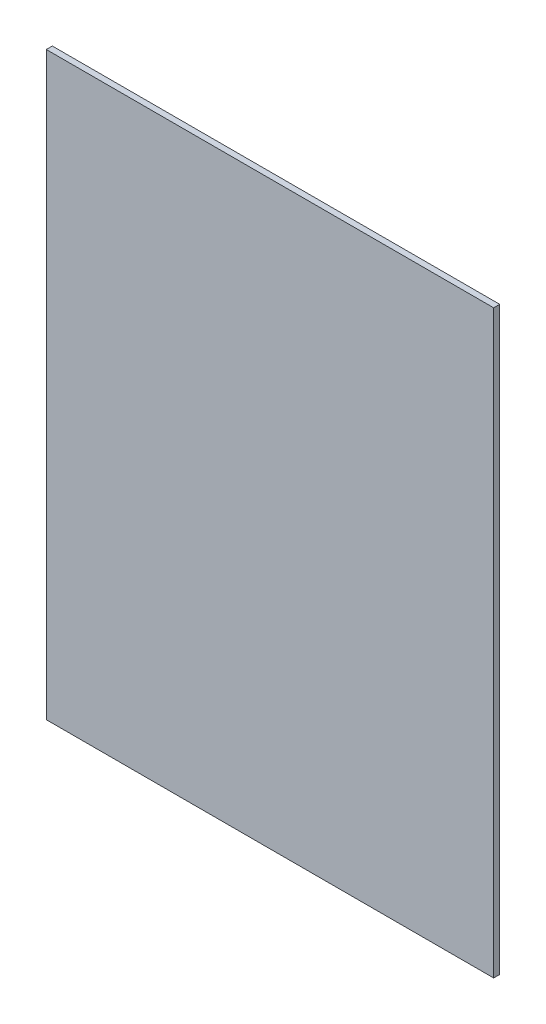
ISO-10303-21;
HEADER;
FILE_DESCRIPTION(('STEP AP214'),'2;1');
FILE_NAME('part.step','',(''),(''),'','','');
FILE_SCHEMA(('AUTOMOTIVE_DESIGN { 1 0 10303 214 1 1 1 1 }'));
ENDSEC;
DATA;
#1=APPLICATION_CONTEXT('core data for automotive mechanical design processes');
#2=APPLICATION_PROTOCOL_DEFINITION('international standard','automotive_design',2000,#1);
#3=PRODUCT_CONTEXT('',#1,'mechanical');
#4=PRODUCT('Part','Part','',(#3));
#5=PRODUCT_RELATED_PRODUCT_CATEGORY('part','',(#4));
#6=PRODUCT_DEFINITION_FORMATION('','',#4);
#7=PRODUCT_DEFINITION_CONTEXT('part definition',#1,'design');
#8=PRODUCT_DEFINITION('design','',#6,#7);
#9=PRODUCT_DEFINITION_SHAPE('','',#8);
#10=(LENGTH_UNIT() NAMED_UNIT(*) SI_UNIT(.MILLI.,.METRE.));
#11=(NAMED_UNIT(*) PLANE_ANGLE_UNIT() SI_UNIT($,.RADIAN.));
#12=(NAMED_UNIT(*) SI_UNIT($,.STERADIAN.) SOLID_ANGLE_UNIT());
#13=UNCERTAINTY_MEASURE_WITH_UNIT(LENGTH_MEASURE(1.E-05),#10,'distance_accuracy_value','');
#14=(GEOMETRIC_REPRESENTATION_CONTEXT(3) GLOBAL_UNCERTAINTY_ASSIGNED_CONTEXT((#13)) GLOBAL_UNIT_ASSIGNED_CONTEXT((#10,
#11,#12)) REPRESENTATION_CONTEXT('',''));
#15=CARTESIAN_POINT('',(0.,0.,0.));
#16=DIRECTION('',(0.,0.,1.));
#17=DIRECTION('',(1.,0.,0.));
#18=AXIS2_PLACEMENT_3D('',#15,#16,#17);
#19=CARTESIAN_POINT('',(117.475,-152.4,3.175));
#20=DIRECTION('',(-1.,0.,0.));
#21=DIRECTION('',(0.,0.,1.));
#22=AXIS2_PLACEMENT_3D('',#19,#20,#21);
#23=PLANE('',#22);
#24=DIRECTION('',(0.,1.,0.));
#25=VECTOR('',#24,1.);
#26=CARTESIAN_POINT('',(117.475,-152.4,0.));
#27=LINE('',#26,#25);
#28=CARTESIAN_POINT('',(117.475,-152.4,0.));
#29=VERTEX_POINT('',#28);
#30=CARTESIAN_POINT('',(117.475,152.4,0.));
#31=VERTEX_POINT('',#30);
#32=EDGE_CURVE('E94',#29,#31,#27,.T.);
#33=ORIENTED_EDGE('',*,*,#32,.T.);
#34=DIRECTION('',(0.,0.,-1.));
#35=VECTOR('',#34,1.);
#36=CARTESIAN_POINT('',(117.475,152.4,3.175));
#37=LINE('',#36,#35);
#38=CARTESIAN_POINT('',(117.475,152.4,3.175));
#39=VERTEX_POINT('',#38);
#40=EDGE_CURVE('E11',#39,#31,#37,.T.);
#41=ORIENTED_EDGE('',*,*,#40,.F.);
#42=DIRECTION('',(0.,1.,0.));
#43=VECTOR('',#42,1.);
#44=CARTESIAN_POINT('',(117.475,-152.4,3.175));
#45=LINE('',#44,#43);
#46=CARTESIAN_POINT('',(117.475,-152.4,3.175));
#47=VERTEX_POINT('',#46);
#48=EDGE_CURVE('E82',#47,#39,#45,.T.);
#49=ORIENTED_EDGE('',*,*,#48,.F.);
#50=DIRECTION('',(0.,0.,-1.));
#51=VECTOR('',#50,1.);
#52=CARTESIAN_POINT('',(117.475,-152.4,3.175));
#53=LINE('',#52,#51);
#54=EDGE_CURVE('E90',#47,#29,#53,.T.);
#55=ORIENTED_EDGE('',*,*,#54,.T.);
#56=EDGE_LOOP('',(#33,#41,#49,#55));
#57=FACE_BOUND('',#56,.T.);
#58=ADVANCED_FACE('F31',(#57),#23,.F.);
#59=CARTESIAN_POINT('',(-117.475,152.4,3.175));
#60=DIRECTION('',(0.,-1.,0.));
#61=DIRECTION('',(0.,0.,-1.));
#62=AXIS2_PLACEMENT_3D('',#59,#60,#61);
#63=PLANE('',#62);
#64=DIRECTION('',(-1.,0.,0.));
#65=VECTOR('',#64,1.);
#66=CARTESIAN_POINT('',(-117.475,152.4,0.));
#67=LINE('',#66,#65);
#68=CARTESIAN_POINT('',(-117.475,152.4,0.));
#69=VERTEX_POINT('',#68);
#70=EDGE_CURVE('E86',#31,#69,#67,.T.);
#71=ORIENTED_EDGE('',*,*,#70,.T.);
#72=DIRECTION('',(0.,0.,-1.));
#73=VECTOR('',#72,1.);
#74=CARTESIAN_POINT('',(-117.475,152.4,3.175));
#75=LINE('',#74,#73);
#76=CARTESIAN_POINT('',(-117.475,152.4,3.175));
#77=VERTEX_POINT('',#76);
#78=EDGE_CURVE('E39',#77,#69,#75,.T.);
#79=ORIENTED_EDGE('',*,*,#78,.F.);
#80=DIRECTION('',(-1.,0.,0.));
#81=VECTOR('',#80,1.);
#82=CARTESIAN_POINT('',(-117.475,152.4,3.175));
#83=LINE('',#82,#81);
#84=EDGE_CURVE('E77',#39,#77,#83,.T.);
#85=ORIENTED_EDGE('',*,*,#84,.F.);
#86=ORIENTED_EDGE('',*,*,#40,.T.);
#87=EDGE_LOOP('',(#71,#79,#85,#86));
#88=FACE_BOUND('',#87,.T.);
#89=ADVANCED_FACE('F85',(#88),#63,.F.);
#90=CARTESIAN_POINT('',(-117.475,-152.4,3.175));
#91=DIRECTION('',(1.,0.,0.));
#92=DIRECTION('',(0.,0.,-1.));
#93=AXIS2_PLACEMENT_3D('',#90,#91,#92);
#94=PLANE('',#93);
#95=DIRECTION('',(0.,-1.,0.));
#96=VECTOR('',#95,1.);
#97=CARTESIAN_POINT('',(-117.475,-152.4,0.));
#98=LINE('',#97,#96);
#99=CARTESIAN_POINT('',(-117.475,-152.4,0.));
#100=VERTEX_POINT('',#99);
#101=EDGE_CURVE('E64',#69,#100,#98,.T.);
#102=ORIENTED_EDGE('',*,*,#101,.T.);
#103=DIRECTION('',(0.,0.,-1.));
#104=VECTOR('',#103,1.);
#105=CARTESIAN_POINT('',(-117.475,-152.4,3.175));
#106=LINE('',#105,#104);
#107=CARTESIAN_POINT('',(-117.475,-152.4,3.175));
#108=VERTEX_POINT('',#107);
#109=EDGE_CURVE('E87',#108,#100,#106,.T.);
#110=ORIENTED_EDGE('',*,*,#109,.F.);
#111=DIRECTION('',(0.,-1.,0.));
#112=VECTOR('',#111,1.);
#113=CARTESIAN_POINT('',(-117.475,-152.4,3.175));
#114=LINE('',#113,#112);
#115=EDGE_CURVE('E80',#77,#108,#114,.T.);
#116=ORIENTED_EDGE('',*,*,#115,.F.);
#117=ORIENTED_EDGE('',*,*,#78,.T.);
#118=EDGE_LOOP('',(#102,#110,#116,#117));
#119=FACE_BOUND('',#118,.T.);
#120=ADVANCED_FACE('F88',(#119),#94,.F.);
#121=CARTESIAN_POINT('',(-117.475,-152.4,3.175));
#122=DIRECTION('',(0.,1.,0.));
#123=DIRECTION('',(0.,0.,1.));
#124=AXIS2_PLACEMENT_3D('',#121,#122,#123);
#125=PLANE('',#124);
#126=DIRECTION('',(1.,0.,0.));
#127=VECTOR('',#126,1.);
#128=CARTESIAN_POINT('',(-117.475,-152.4,0.));
#129=LINE('',#128,#127);
#130=EDGE_CURVE('E70',#100,#29,#129,.T.);
#131=ORIENTED_EDGE('',*,*,#130,.T.);
#132=ORIENTED_EDGE('',*,*,#54,.F.);
#133=DIRECTION('',(1.,0.,0.));
#134=VECTOR('',#133,1.);
#135=CARTESIAN_POINT('',(-117.475,-152.4,3.175));
#136=LINE('',#135,#134);
#137=EDGE_CURVE('E47',#108,#47,#136,.T.);
#138=ORIENTED_EDGE('',*,*,#137,.F.);
#139=ORIENTED_EDGE('',*,*,#109,.T.);
#140=EDGE_LOOP('',(#131,#132,#138,#139));
#141=FACE_BOUND('',#140,.T.);
#142=ADVANCED_FACE('F101',(#141),#125,.F.);
#143=CARTESIAN_POINT('',(117.475,152.4,3.175));
#144=DIRECTION('',(0.,0.,-1.));
#145=DIRECTION('',(-1.,0.,0.));
#146=AXIS2_PLACEMENT_3D('',#143,#144,#145);
#147=PLANE('',#146);
#148=ORIENTED_EDGE('',*,*,#48,.T.);
#149=ORIENTED_EDGE('',*,*,#84,.T.);
#150=ORIENTED_EDGE('',*,*,#115,.T.);
#151=ORIENTED_EDGE('',*,*,#137,.T.);
#152=EDGE_LOOP('',(#148,#149,#150,#151));
#153=FACE_BOUND('',#152,.T.);
#154=ADVANCED_FACE('F78',(#153),#147,.F.);
#155=CARTESIAN_POINT('',(117.475,152.4,0.));
#156=DIRECTION('',(0.,0.,-1.));
#157=DIRECTION('',(-1.,0.,0.));
#158=AXIS2_PLACEMENT_3D('',#155,#156,#157);
#159=PLANE('',#158);
#160=ORIENTED_EDGE('',*,*,#32,.F.);
#161=ORIENTED_EDGE('',*,*,#130,.F.);
#162=ORIENTED_EDGE('',*,*,#101,.F.);
#163=ORIENTED_EDGE('',*,*,#70,.F.);
#164=EDGE_LOOP('',(#160,#161,#162,#163));
#165=FACE_BOUND('',#164,.T.);
#166=ADVANCED_FACE('F104',(#165),#159,.T.);
#167=CLOSED_SHELL('',(#58,#89,#120,#142,#154,#166));
#168=MANIFOLD_SOLID_BREP('B2',#167);
#169=ADVANCED_BREP_SHAPE_REPRESENTATION('',(#18,#168),#14);
#170=SHAPE_DEFINITION_REPRESENTATION(#9,#169);
ENDSEC;
END-ISO-10303-21;
